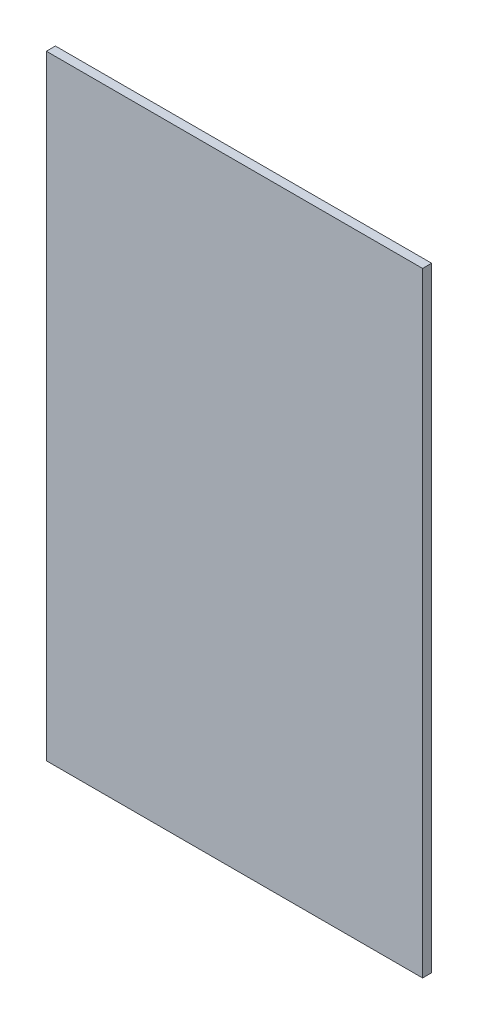
ISO-10303-21;
HEADER;
FILE_DESCRIPTION(('STEP AP214'),'2;1');
FILE_NAME('part.step','',(''),(''),'','','');
FILE_SCHEMA(('AUTOMOTIVE_DESIGN { 1 0 10303 214 1 1 1 1 }'));
ENDSEC;
DATA;
#1=APPLICATION_CONTEXT('core data for automotive mechanical design processes');
#2=APPLICATION_PROTOCOL_DEFINITION('international standard','automotive_design',2000,#1);
#3=PRODUCT_CONTEXT('',#1,'mechanical');
#4=PRODUCT('Part','Part','',(#3));
#5=PRODUCT_RELATED_PRODUCT_CATEGORY('part','',(#4));
#6=PRODUCT_DEFINITION_FORMATION('','',#4);
#7=PRODUCT_DEFINITION_CONTEXT('part definition',#1,'design');
#8=PRODUCT_DEFINITION('design','',#6,#7);
#9=PRODUCT_DEFINITION_SHAPE('','',#8);
#10=(LENGTH_UNIT() NAMED_UNIT(*) SI_UNIT(.MILLI.,.METRE.));
#11=(NAMED_UNIT(*) PLANE_ANGLE_UNIT() SI_UNIT($,.RADIAN.));
#12=(NAMED_UNIT(*) SI_UNIT($,.STERADIAN.) SOLID_ANGLE_UNIT());
#13=UNCERTAINTY_MEASURE_WITH_UNIT(LENGTH_MEASURE(1.E-05),#10,'distance_accuracy_value','');
#14=(GEOMETRIC_REPRESENTATION_CONTEXT(3) GLOBAL_UNCERTAINTY_ASSIGNED_CONTEXT((#13)) GLOBAL_UNIT_ASSIGNED_CONTEXT((#10,
#11,#12)) REPRESENTATION_CONTEXT('',''));
#15=CARTESIAN_POINT('',(0.,0.,0.));
#16=DIRECTION('',(0.,0.,1.));
#17=DIRECTION('',(1.,0.,0.));
#18=AXIS2_PLACEMENT_3D('',#15,#16,#17);
#19=CARTESIAN_POINT('',(-64.5618556701031,50.451030927835,3.6));
#20=DIRECTION('',(1.,0.,0.));
#21=DIRECTION('',(0.,1.,0.));
#22=AXIS2_PLACEMENT_3D('',#19,#20,#21);
#23=PLANE('',#22);
#24=DIRECTION('',(0.,-1.,0.));
#25=VECTOR('',#24,1.);
#26=CARTESIAN_POINT('',(-64.5618556701031,50.451030927835,0.));
#27=LINE('',#26,#25);
#28=CARTESIAN_POINT('',(-64.5618556701031,50.451030927835,0.));
#29=VERTEX_POINT('',#28);
#30=CARTESIAN_POINT('',(-64.5618556701031,-194.548969072165,0.));
#31=VERTEX_POINT('',#30);
#32=EDGE_CURVE('E95',#29,#31,#27,.T.);
#33=ORIENTED_EDGE('',*,*,#32,.T.);
#34=DIRECTION('',(0.,0.,-1.));
#35=VECTOR('',#34,1.);
#36=CARTESIAN_POINT('',(-64.5618556701031,-194.548969072165,3.6));
#37=LINE('',#36,#35);
#38=CARTESIAN_POINT('',(-64.5618556701031,-194.548969072165,3.6));
#39=VERTEX_POINT('',#38);
#40=EDGE_CURVE('E11',#39,#31,#37,.T.);
#41=ORIENTED_EDGE('',*,*,#40,.F.);
#42=DIRECTION('',(0.,-1.,0.));
#43=VECTOR('',#42,1.);
#44=CARTESIAN_POINT('',(-64.5618556701031,50.451030927835,3.6));
#45=LINE('',#44,#43);
#46=CARTESIAN_POINT('',(-64.5618556701031,50.451030927835,3.6));
#47=VERTEX_POINT('',#46);
#48=EDGE_CURVE('E83',#47,#39,#45,.T.);
#49=ORIENTED_EDGE('',*,*,#48,.F.);
#50=DIRECTION('',(0.,0.,-1.));
#51=VECTOR('',#50,1.);
#52=CARTESIAN_POINT('',(-64.5618556701031,50.451030927835,3.6));
#53=LINE('',#52,#51);
#54=EDGE_CURVE('E91',#47,#29,#53,.T.);
#55=ORIENTED_EDGE('',*,*,#54,.T.);
#56=EDGE_LOOP('',(#33,#41,#49,#55));
#57=FACE_BOUND('',#56,.T.);
#58=ADVANCED_FACE('F32',(#57),#23,.F.);
#59=CARTESIAN_POINT('',(-64.5618556701031,-194.548969072165,3.6));
#60=DIRECTION('',(0.,1.,0.));
#61=DIRECTION('',(0.,0.,1.));
#62=AXIS2_PLACEMENT_3D('',#59,#60,#61);
#63=PLANE('',#62);
#64=DIRECTION('',(1.,0.,0.));
#65=VECTOR('',#64,1.);
#66=CARTESIAN_POINT('',(-64.5618556701031,-194.548969072165,0.));
#67=LINE('',#66,#65);
#68=CARTESIAN_POINT('',(85.4381443298969,-194.548969072165,0.));
#69=VERTEX_POINT('',#68);
#70=EDGE_CURVE('E87',#31,#69,#67,.T.);
#71=ORIENTED_EDGE('',*,*,#70,.T.);
#72=DIRECTION('',(0.,0.,-1.));
#73=VECTOR('',#72,1.);
#74=CARTESIAN_POINT('',(85.4381443298969,-194.548969072165,3.6));
#75=LINE('',#74,#73);
#76=CARTESIAN_POINT('',(85.4381443298969,-194.548969072165,3.6));
#77=VERTEX_POINT('',#76);
#78=EDGE_CURVE('E40',#77,#69,#75,.T.);
#79=ORIENTED_EDGE('',*,*,#78,.F.);
#80=DIRECTION('',(1.,0.,0.));
#81=VECTOR('',#80,1.);
#82=CARTESIAN_POINT('',(-64.5618556701031,-194.548969072165,3.6));
#83=LINE('',#82,#81);
#84=EDGE_CURVE('E78',#39,#77,#83,.T.);
#85=ORIENTED_EDGE('',*,*,#84,.F.);
#86=ORIENTED_EDGE('',*,*,#40,.T.);
#87=EDGE_LOOP('',(#71,#79,#85,#86));
#88=FACE_BOUND('',#87,.T.);
#89=ADVANCED_FACE('F86',(#88),#63,.F.);
#90=CARTESIAN_POINT('',(85.4381443298969,50.451030927835,3.6));
#91=DIRECTION('',(-1.,0.,0.));
#92=DIRECTION('',(0.,-1.,0.));
#93=AXIS2_PLACEMENT_3D('',#90,#91,#92);
#94=PLANE('',#93);
#95=DIRECTION('',(0.,1.,0.));
#96=VECTOR('',#95,1.);
#97=CARTESIAN_POINT('',(85.4381443298969,50.451030927835,0.));
#98=LINE('',#97,#96);
#99=CARTESIAN_POINT('',(85.4381443298969,50.451030927835,0.));
#100=VERTEX_POINT('',#99);
#101=EDGE_CURVE('E65',#69,#100,#98,.T.);
#102=ORIENTED_EDGE('',*,*,#101,.T.);
#103=DIRECTION('',(0.,0.,-1.));
#104=VECTOR('',#103,1.);
#105=CARTESIAN_POINT('',(85.4381443298969,50.451030927835,3.6));
#106=LINE('',#105,#104);
#107=CARTESIAN_POINT('',(85.4381443298969,50.451030927835,3.6));
#108=VERTEX_POINT('',#107);
#109=EDGE_CURVE('E88',#108,#100,#106,.T.);
#110=ORIENTED_EDGE('',*,*,#109,.F.);
#111=DIRECTION('',(0.,1.,0.));
#112=VECTOR('',#111,1.);
#113=CARTESIAN_POINT('',(85.4381443298969,50.451030927835,3.6));
#114=LINE('',#113,#112);
#115=EDGE_CURVE('E81',#77,#108,#114,.T.);
#116=ORIENTED_EDGE('',*,*,#115,.F.);
#117=ORIENTED_EDGE('',*,*,#78,.T.);
#118=EDGE_LOOP('',(#102,#110,#116,#117));
#119=FACE_BOUND('',#118,.T.);
#120=ADVANCED_FACE('F89',(#119),#94,.F.);
#121=CARTESIAN_POINT('',(-64.5618556701031,50.451030927835,3.6));
#122=DIRECTION('',(0.,-1.,0.));
#123=DIRECTION('',(0.,0.,-1.));
#124=AXIS2_PLACEMENT_3D('',#121,#122,#123);
#125=PLANE('',#124);
#126=DIRECTION('',(-1.,0.,0.));
#127=VECTOR('',#126,1.);
#128=CARTESIAN_POINT('',(-64.5618556701031,50.451030927835,0.));
#129=LINE('',#128,#127);
#130=EDGE_CURVE('E71',#100,#29,#129,.T.);
#131=ORIENTED_EDGE('',*,*,#130,.T.);
#132=ORIENTED_EDGE('',*,*,#54,.F.);
#133=DIRECTION('',(-1.,0.,0.));
#134=VECTOR('',#133,1.);
#135=CARTESIAN_POINT('',(-64.5618556701031,50.451030927835,3.6));
#136=LINE('',#135,#134);
#137=EDGE_CURVE('E48',#108,#47,#136,.T.);
#138=ORIENTED_EDGE('',*,*,#137,.F.);
#139=ORIENTED_EDGE('',*,*,#109,.T.);
#140=EDGE_LOOP('',(#131,#132,#138,#139));
#141=FACE_BOUND('',#140,.T.);
#142=ADVANCED_FACE('F102',(#141),#125,.F.);
#143=CARTESIAN_POINT('',(0.,0.,3.6));
#144=DIRECTION('',(0.,0.,1.));
#145=DIRECTION('',(1.,0.,0.));
#146=AXIS2_PLACEMENT_3D('',#143,#144,#145);
#147=PLANE('',#146);
#148=ORIENTED_EDGE('',*,*,#48,.T.);
#149=ORIENTED_EDGE('',*,*,#84,.T.);
#150=ORIENTED_EDGE('',*,*,#115,.T.);
#151=ORIENTED_EDGE('',*,*,#137,.T.);
#152=EDGE_LOOP('',(#148,#149,#150,#151));
#153=FACE_BOUND('',#152,.T.);
#154=ADVANCED_FACE('F79',(#153),#147,.T.);
#155=CARTESIAN_POINT('',(0.,0.,0.));
#156=DIRECTION('',(0.,0.,1.));
#157=DIRECTION('',(1.,0.,0.));
#158=AXIS2_PLACEMENT_3D('',#155,#156,#157);
#159=PLANE('',#158);
#160=ORIENTED_EDGE('',*,*,#32,.F.);
#161=ORIENTED_EDGE('',*,*,#130,.F.);
#162=ORIENTED_EDGE('',*,*,#101,.F.);
#163=ORIENTED_EDGE('',*,*,#70,.F.);
#164=EDGE_LOOP('',(#160,#161,#162,#163));
#165=FACE_BOUND('',#164,.T.);
#166=ADVANCED_FACE('F105',(#165),#159,.F.);
#167=CLOSED_SHELL('',(#58,#89,#120,#142,#154,#166));
#168=MANIFOLD_SOLID_BREP('B2',#167);
#169=ADVANCED_BREP_SHAPE_REPRESENTATION('',(#18,#168),#14);
#170=SHAPE_DEFINITION_REPRESENTATION(#9,#169);
ENDSEC;
END-ISO-10303-21;
